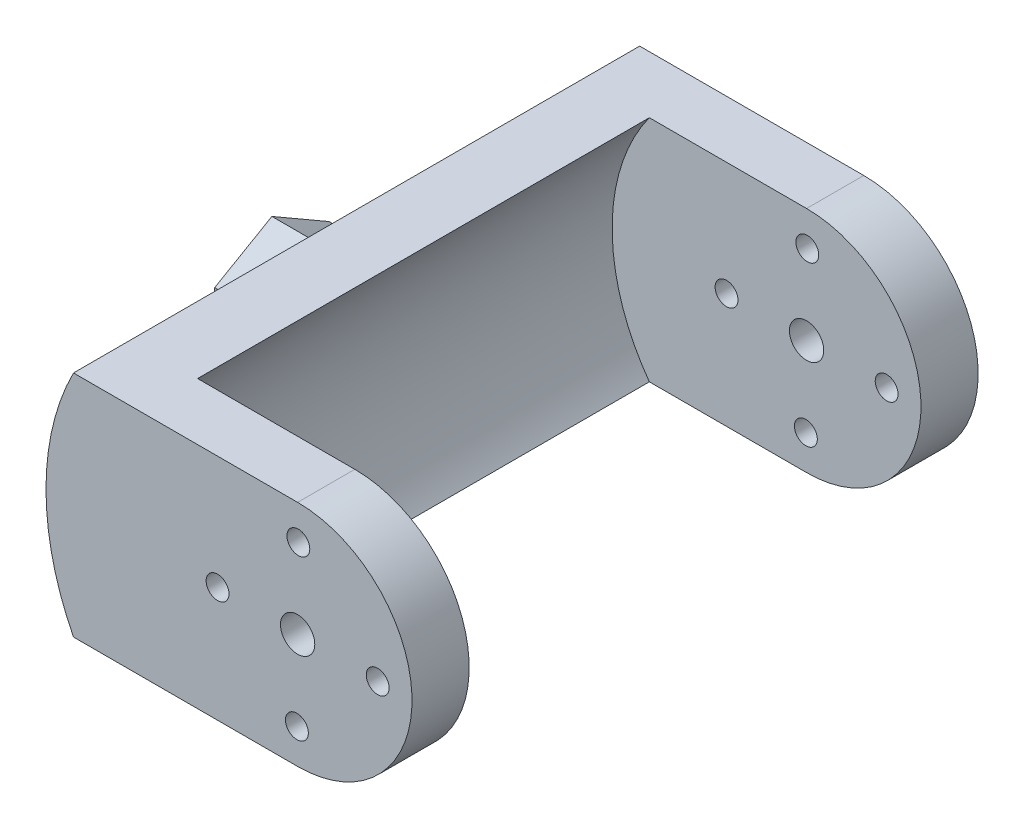
ISO-10303-21;
HEADER;
FILE_DESCRIPTION(('STEP AP214'),'2;1');
FILE_NAME('part.step','',(''),(''),'','','');
FILE_SCHEMA(('AUTOMOTIVE_DESIGN { 1 0 10303 214 1 1 1 1 }'));
ENDSEC;
DATA;
#1=APPLICATION_CONTEXT('core data for automotive mechanical design processes');
#2=APPLICATION_PROTOCOL_DEFINITION('international standard','automotive_design',2000,#1);
#3=PRODUCT_CONTEXT('',#1,'mechanical');
#4=PRODUCT('Part','Part','',(#3));
#5=PRODUCT_RELATED_PRODUCT_CATEGORY('part','',(#4));
#6=PRODUCT_DEFINITION_FORMATION('','',#4);
#7=PRODUCT_DEFINITION_CONTEXT('part definition',#1,'design');
#8=PRODUCT_DEFINITION('design','',#6,#7);
#9=PRODUCT_DEFINITION_SHAPE('','',#8);
#10=(LENGTH_UNIT() NAMED_UNIT(*) SI_UNIT(.MILLI.,.METRE.));
#11=(NAMED_UNIT(*) PLANE_ANGLE_UNIT() SI_UNIT($,.RADIAN.));
#12=(NAMED_UNIT(*) SI_UNIT($,.STERADIAN.) SOLID_ANGLE_UNIT());
#13=UNCERTAINTY_MEASURE_WITH_UNIT(LENGTH_MEASURE(1.E-05),#10,'distance_accuracy_value','');
#14=(GEOMETRIC_REPRESENTATION_CONTEXT(3) GLOBAL_UNCERTAINTY_ASSIGNED_CONTEXT((#13)) GLOBAL_UNIT_ASSIGNED_CONTEXT((#10,
#11,#12)) REPRESENTATION_CONTEXT('',''));
#15=CARTESIAN_POINT('',(0.,0.,0.));
#16=DIRECTION('',(0.,0.,1.));
#17=DIRECTION('',(1.,0.,0.));
#18=AXIS2_PLACEMENT_3D('',#15,#16,#17);
#19=CARTESIAN_POINT('',(18.4154031423768,-9.29712918660288,-44.5));
#20=DIRECTION('',(0.,0.,1.));
#21=DIRECTION('',(1.,0.,0.));
#22=AXIS2_PLACEMENT_3D('',#19,#20,#21);
#23=CYLINDRICAL_SURFACE('',#22,22.);
#24=CARTESIAN_POINT('',(18.4154031423768,-9.29712918660288,5.));
#25=DIRECTION('',(0.,0.,1.));
#26=DIRECTION('',(1.,0.,0.));
#27=AXIS2_PLACEMENT_3D('',#24,#25,#26);
#28=CIRCLE('',#27,22.);
#29=CARTESIAN_POINT('',(-1.1805147998886,0.70287081339713,5.));
#30=VERTEX_POINT('',#29);
#31=CARTESIAN_POINT('',(-1.18051479988861,-19.2971291866029,5.));
#32=VERTEX_POINT('',#31);
#33=EDGE_CURVE('E220',#30,#32,#28,.T.);
#34=ORIENTED_EDGE('',*,*,#33,.F.);
#35=DIRECTION('',(0.,0.,1.));
#36=VECTOR('',#35,1.);
#37=CARTESIAN_POINT('',(-1.1805147998886,0.70287081339713,-44.5));
#38=LINE('',#37,#36);
#39=CARTESIAN_POINT('',(-1.1805147998886,0.70287081339713,-44.5));
#40=VERTEX_POINT('',#39);
#41=EDGE_CURVE('E236',#40,#30,#38,.T.);
#42=ORIENTED_EDGE('',*,*,#41,.F.);
#43=CARTESIAN_POINT('',(18.4154031423768,-9.29712918660288,-44.5));
#44=DIRECTION('',(0.,0.,1.));
#45=DIRECTION('',(1.,0.,0.));
#46=AXIS2_PLACEMENT_3D('',#43,#44,#45);
#47=CIRCLE('',#46,22.);
#48=CARTESIAN_POINT('',(-1.18051479988861,-19.2971291866029,-44.5));
#49=VERTEX_POINT('',#48);
#50=EDGE_CURVE('E223',#40,#49,#47,.T.);
#51=ORIENTED_EDGE('',*,*,#50,.T.);
#52=DIRECTION('',(0.,0.,1.));
#53=VECTOR('',#52,1.);
#54=CARTESIAN_POINT('',(-1.18051479988861,-19.2971291866029,-44.5));
#55=LINE('',#54,#53);
#56=EDGE_CURVE('E233',#49,#32,#55,.T.);
#57=ORIENTED_EDGE('',*,*,#56,.T.);
#58=EDGE_LOOP('',(#34,#42,#51,#57));
#59=FACE_BOUND('',#58,.T.);
#60=CARTESIAN_POINT('',(18.4154031423768,-9.29712918660288,-9.74999999999999));
#61=DIRECTION('',(0.,0.866025403784439,-0.5));
#62=DIRECTION('',(0.,0.5,0.866025403784439));
#63=AXIS2_PLACEMENT_3D('',#60,#61,#62);
#64=ELLIPSE('',#63,44.,22.);
#65=CARTESIAN_POINT('',(-3.39438059489731,-12.183880532551,-14.75));
#66=VERTEX_POINT('',#65);
#67=CARTESIAN_POINT('',(-2.81350796174406,-15.0706318784991,-19.75));
#68=VERTEX_POINT('',#67);
#69=EDGE_CURVE('E294',#66,#68,#64,.F.);
#70=ORIENTED_EDGE('',*,*,#69,.T.);
#71=CARTESIAN_POINT('',(18.4154031423768,-9.29712918660288,-29.75));
#72=DIRECTION('',(0.,0.866025403784439,0.5));
#73=DIRECTION('',(0.,-0.5,0.866025403784439));
#74=AXIS2_PLACEMENT_3D('',#71,#72,#73);
#75=ELLIPSE('',#74,44.,22.);
#76=CARTESIAN_POINT('',(-3.3943805948973,-12.183880532551,-24.75));
#77=VERTEX_POINT('',#76);
#78=EDGE_CURVE('E11',#68,#77,#75,.F.);
#79=ORIENTED_EDGE('',*,*,#78,.T.);
#80=CARTESIAN_POINT('',(18.4154031423768,-9.29712918660288,-24.75));
#81=DIRECTION('',(0.,0.,1.));
#82=DIRECTION('',(1.,0.,0.));
#83=AXIS2_PLACEMENT_3D('',#80,#81,#82);
#84=CIRCLE('',#83,22.);
#85=CARTESIAN_POINT('',(-3.39438059489731,-6.41037784065474,-24.75));
#86=VERTEX_POINT('',#85);
#87=EDGE_CURVE('E40',#77,#86,#84,.F.);
#88=ORIENTED_EDGE('',*,*,#87,.T.);
#89=CARTESIAN_POINT('',(18.4154031423768,-9.29712918660288,-29.75));
#90=DIRECTION('',(0.,-0.866025403784439,0.5));
#91=DIRECTION('',(0.,0.5,0.866025403784439));
#92=AXIS2_PLACEMENT_3D('',#89,#90,#91);
#93=ELLIPSE('',#92,44.,22.);
#94=CARTESIAN_POINT('',(-2.81350796174407,-3.52362649470662,-19.75));
#95=VERTEX_POINT('',#94);
#96=EDGE_CURVE('E303',#86,#95,#93,.F.);
#97=ORIENTED_EDGE('',*,*,#96,.T.);
#98=CARTESIAN_POINT('',(18.4154031423768,-9.29712918660288,-9.74999999999999));
#99=DIRECTION('',(0.,-0.866025403784439,-0.5));
#100=DIRECTION('',(0.,-0.5,0.866025403784439));
#101=AXIS2_PLACEMENT_3D('',#98,#99,#100);
#102=ELLIPSE('',#101,44.,22.);
#103=CARTESIAN_POINT('',(-3.3943805948973,-6.41037784065474,-14.75));
#104=VERTEX_POINT('',#103);
#105=EDGE_CURVE('E300',#95,#104,#102,.F.);
#106=ORIENTED_EDGE('',*,*,#105,.T.);
#107=CARTESIAN_POINT('',(18.4154031423768,-9.29712918660288,-14.75));
#108=DIRECTION('',(0.,0.,-1.));
#109=DIRECTION('',(0.,1.,0.));
#110=AXIS2_PLACEMENT_3D('',#107,#108,#109);
#111=CIRCLE('',#110,22.);
#112=EDGE_CURVE('E297',#104,#66,#111,.F.);
#113=ORIENTED_EDGE('',*,*,#112,.T.);
#114=EDGE_LOOP('',(#70,#79,#88,#97,#106,#113));
#115=FACE_BOUND('',#114,.T.);
#116=ADVANCED_FACE('F32',(#59,#115),#23,.T.);
#117=CARTESIAN_POINT('',(18.4154031423768,-9.29712918660288,-44.5));
#118=DIRECTION('',(0.,0.,1.));
#119=DIRECTION('',(1.,0.,0.));
#120=AXIS2_PLACEMENT_3D('',#117,#118,#119);
#121=CYLINDRICAL_SURFACE('',#120,17.);
#122=CARTESIAN_POINT('',(18.4154031423768,-9.29712918660288,-39.5));
#123=DIRECTION('',(0.,0.,-1.));
#124=DIRECTION('',(-1.,0.,0.));
#125=AXIS2_PLACEMENT_3D('',#122,#123,#124);
#126=CIRCLE('',#125,17.);
#127=CARTESIAN_POINT('',(4.66767605750929,-19.2971291866029,-39.5));
#128=VERTEX_POINT('',#127);
#129=CARTESIAN_POINT('',(4.6676760575093,0.702870813397126,-39.5));
#130=VERTEX_POINT('',#129);
#131=EDGE_CURVE('E292',#128,#130,#126,.T.);
#132=ORIENTED_EDGE('',*,*,#131,.T.);
#133=DIRECTION('',(0.,0.,1.));
#134=VECTOR('',#133,1.);
#135=CARTESIAN_POINT('',(4.6676760575093,0.702870813397128,-44.5));
#136=LINE('',#135,#134);
#137=CARTESIAN_POINT('',(4.6676760575093,0.702870813397121,0.));
#138=VERTEX_POINT('',#137);
#139=EDGE_CURVE('E228',#130,#138,#136,.T.);
#140=ORIENTED_EDGE('',*,*,#139,.T.);
#141=CARTESIAN_POINT('',(18.4154031423768,-9.29712918660288,0.));
#142=DIRECTION('',(0.,0.,1.));
#143=DIRECTION('',(1.,0.,0.));
#144=AXIS2_PLACEMENT_3D('',#141,#142,#143);
#145=CIRCLE('',#144,17.);
#146=CARTESIAN_POINT('',(4.6676760575093,-19.2971291866029,0.));
#147=VERTEX_POINT('',#146);
#148=EDGE_CURVE('E232',#147,#138,#145,.F.);
#149=ORIENTED_EDGE('',*,*,#148,.F.);
#150=DIRECTION('',(0.,0.,1.));
#151=VECTOR('',#150,1.);
#152=CARTESIAN_POINT('',(4.66767605750929,-19.2971291866029,-44.5));
#153=LINE('',#152,#151);
#154=EDGE_CURVE('E55',#128,#147,#153,.T.);
#155=ORIENTED_EDGE('',*,*,#154,.F.);
#156=EDGE_LOOP('',(#132,#140,#149,#155));
#157=FACE_BOUND('',#156,.T.);
#158=ADVANCED_FACE('F326',(#157),#121,.F.);
#159=CARTESIAN_POINT('',(-4.03454117826684,-8.29712918660287,5.));
#160=DIRECTION('',(0.,0.,1.));
#161=DIRECTION('',(1.,0.,0.));
#162=AXIS2_PLACEMENT_3D('',#159,#160,#161);
#163=PLANE('',#162);
#164=DIRECTION('',(1.,0.,0.));
#165=VECTOR('',#164,1.);
#166=CARTESIAN_POINT('',(26.1986671424018,-19.2971291866029,5.));
#167=LINE('',#166,#165);
#168=CARTESIAN_POINT('',(18.4154031423768,-19.2971291866029,5.));
#169=VERTEX_POINT('',#168);
#170=EDGE_CURVE('E243',#32,#169,#167,.T.);
#171=ORIENTED_EDGE('',*,*,#170,.T.);
#172=CARTESIAN_POINT('',(18.4154031423768,-9.29712918660288,5.));
#173=DIRECTION('',(0.,0.,1.));
#174=DIRECTION('',(1.,0.,0.));
#175=AXIS2_PLACEMENT_3D('',#172,#173,#174);
#176=CIRCLE('',#175,10.);
#177=CARTESIAN_POINT('',(18.4154031423768,0.702870813397129,5.));
#178=VERTEX_POINT('',#177);
#179=EDGE_CURVE('E282',#169,#178,#176,.T.);
#180=ORIENTED_EDGE('',*,*,#179,.T.);
#181=DIRECTION('',(-1.,0.,0.));
#182=VECTOR('',#181,1.);
#183=CARTESIAN_POINT('',(26.1986671424018,0.702870813397122,5.));
#184=LINE('',#183,#182);
#185=EDGE_CURVE('E248',#178,#30,#184,.T.);
#186=ORIENTED_EDGE('',*,*,#185,.T.);
#187=ORIENTED_EDGE('',*,*,#33,.T.);
#188=EDGE_LOOP('',(#171,#180,#186,#187));
#189=FACE_BOUND('',#188,.T.);
#190=CARTESIAN_POINT('',(11.4154031423768,-9.2346746111763,5.));
#191=DIRECTION('',(0.,0.,1.));
#192=DIRECTION('',(1.,0.,0.));
#193=AXIS2_PLACEMENT_3D('',#190,#191,#192);
#194=CIRCLE('',#193,1.);
#195=CARTESIAN_POINT('',(12.4154031423768,-9.2346746111763,5.));
#196=VERTEX_POINT('',#195);
#197=EDGE_CURVE('E258',#196,#196,#194,.T.);
#198=ORIENTED_EDGE('',*,*,#197,.F.);
#199=EDGE_LOOP('',(#198));
#200=FACE_BOUND('',#199,.T.);
#201=CARTESIAN_POINT('',(25.4154031423768,-9.35958376202946,5.));
#202=DIRECTION('',(0.,0.,1.));
#203=DIRECTION('',(1.,0.,0.));
#204=AXIS2_PLACEMENT_3D('',#201,#202,#203);
#205=CIRCLE('',#204,0.999999999999998);
#206=CARTESIAN_POINT('',(26.4154031423768,-9.35958376202946,5.));
#207=VERTEX_POINT('',#206);
#208=EDGE_CURVE('E270',#207,#207,#205,.T.);
#209=ORIENTED_EDGE('',*,*,#208,.F.);
#210=EDGE_LOOP('',(#209));
#211=FACE_BOUND('',#210,.T.);
#212=CARTESIAN_POINT('',(18.4778577178034,-2.29712918660288,5.));
#213=DIRECTION('',(0.,0.,1.));
#214=DIRECTION('',(1.,0.,0.));
#215=AXIS2_PLACEMENT_3D('',#212,#213,#214);
#216=CIRCLE('',#215,1.);
#217=CARTESIAN_POINT('',(19.4778577178034,-2.29712918660288,5.));
#218=VERTEX_POINT('',#217);
#219=EDGE_CURVE('E276',#218,#218,#216,.T.);
#220=ORIENTED_EDGE('',*,*,#219,.F.);
#221=EDGE_LOOP('',(#220));
#222=FACE_BOUND('',#221,.T.);
#223=CARTESIAN_POINT('',(18.4154031423768,-9.29712918660288,5.));
#224=DIRECTION('',(0.,0.,1.));
#225=DIRECTION('',(1.,0.,0.));
#226=AXIS2_PLACEMENT_3D('',#223,#224,#225);
#227=CIRCLE('',#226,1.5);
#228=CARTESIAN_POINT('',(19.9154031423768,-9.29712918660288,5.));
#229=VERTEX_POINT('',#228);
#230=EDGE_CURVE('E264',#229,#229,#227,.T.);
#231=ORIENTED_EDGE('',*,*,#230,.F.);
#232=EDGE_LOOP('',(#231));
#233=FACE_BOUND('',#232,.T.);
#234=CARTESIAN_POINT('',(18.3529485669502,-16.2971291866029,5.));
#235=DIRECTION('',(0.,0.,1.));
#236=DIRECTION('',(1.,0.,0.));
#237=AXIS2_PLACEMENT_3D('',#234,#235,#236);
#238=CIRCLE('',#237,0.999999999999998);
#239=CARTESIAN_POINT('',(19.3529485669502,-16.2971291866029,5.));
#240=VERTEX_POINT('',#239);
#241=EDGE_CURVE('E252',#240,#240,#238,.T.);
#242=ORIENTED_EDGE('',*,*,#241,.F.);
#243=EDGE_LOOP('',(#242));
#244=FACE_BOUND('',#243,.T.);
#245=ADVANCED_FACE('F332',(#189,#200,#211,#222,#233,#244),#163,.T.);
#246=CARTESIAN_POINT('',(-4.03454117826684,-8.29712918660287,0.));
#247=DIRECTION('',(0.,0.,1.));
#248=DIRECTION('',(1.,0.,0.));
#249=AXIS2_PLACEMENT_3D('',#246,#247,#248);
#250=PLANE('',#249);
#251=DIRECTION('',(1.,0.,0.));
#252=VECTOR('',#251,1.);
#253=CARTESIAN_POINT('',(26.1986671424018,-19.2971291866029,0.));
#254=LINE('',#253,#252);
#255=CARTESIAN_POINT('',(18.4154031423768,-19.2971291866029,0.));
#256=VERTEX_POINT('',#255);
#257=EDGE_CURVE('E246',#147,#256,#254,.T.);
#258=ORIENTED_EDGE('',*,*,#257,.F.);
#259=ORIENTED_EDGE('',*,*,#148,.T.);
#260=DIRECTION('',(-1.,0.,0.));
#261=VECTOR('',#260,1.);
#262=CARTESIAN_POINT('',(26.1986671424018,0.702870813397122,0.));
#263=LINE('',#262,#261);
#264=CARTESIAN_POINT('',(18.4154031423768,0.702870813397129,0.));
#265=VERTEX_POINT('',#264);
#266=EDGE_CURVE('E242',#265,#138,#263,.T.);
#267=ORIENTED_EDGE('',*,*,#266,.F.);
#268=CARTESIAN_POINT('',(18.4154031423768,-9.29712918660288,0.));
#269=DIRECTION('',(0.,0.,1.));
#270=DIRECTION('',(1.,0.,0.));
#271=AXIS2_PLACEMENT_3D('',#268,#269,#270);
#272=CIRCLE('',#271,10.);
#273=EDGE_CURVE('E279',#256,#265,#272,.T.);
#274=ORIENTED_EDGE('',*,*,#273,.F.);
#275=EDGE_LOOP('',(#258,#259,#267,#274));
#276=FACE_BOUND('',#275,.T.);
#277=CARTESIAN_POINT('',(18.4778577178034,-2.29712918660288,0.));
#278=DIRECTION('',(0.,0.,1.));
#279=DIRECTION('',(1.,0.,0.));
#280=AXIS2_PLACEMENT_3D('',#277,#278,#279);
#281=CIRCLE('',#280,1.);
#282=CARTESIAN_POINT('',(19.4778577178034,-2.29712918660288,0.));
#283=VERTEX_POINT('',#282);
#284=EDGE_CURVE('E273',#283,#283,#281,.T.);
#285=ORIENTED_EDGE('',*,*,#284,.T.);
#286=EDGE_LOOP('',(#285));
#287=FACE_BOUND('',#286,.T.);
#288=CARTESIAN_POINT('',(25.4154031423768,-9.35958376202946,0.));
#289=DIRECTION('',(0.,0.,1.));
#290=DIRECTION('',(1.,0.,0.));
#291=AXIS2_PLACEMENT_3D('',#288,#289,#290);
#292=CIRCLE('',#291,0.999999999999998);
#293=CARTESIAN_POINT('',(26.4154031423768,-9.35958376202946,0.));
#294=VERTEX_POINT('',#293);
#295=EDGE_CURVE('E267',#294,#294,#292,.T.);
#296=ORIENTED_EDGE('',*,*,#295,.T.);
#297=EDGE_LOOP('',(#296));
#298=FACE_BOUND('',#297,.T.);
#299=CARTESIAN_POINT('',(18.4154031423768,-9.29712918660288,0.));
#300=DIRECTION('',(0.,0.,1.));
#301=DIRECTION('',(1.,0.,0.));
#302=AXIS2_PLACEMENT_3D('',#299,#300,#301);
#303=CIRCLE('',#302,1.5);
#304=CARTESIAN_POINT('',(19.9154031423768,-9.29712918660288,0.));
#305=VERTEX_POINT('',#304);
#306=EDGE_CURVE('E261',#305,#305,#303,.T.);
#307=ORIENTED_EDGE('',*,*,#306,.T.);
#308=EDGE_LOOP('',(#307));
#309=FACE_BOUND('',#308,.T.);
#310=CARTESIAN_POINT('',(11.4154031423768,-9.2346746111763,0.));
#311=DIRECTION('',(0.,0.,1.));
#312=DIRECTION('',(1.,0.,0.));
#313=AXIS2_PLACEMENT_3D('',#310,#311,#312);
#314=CIRCLE('',#313,1.);
#315=CARTESIAN_POINT('',(12.4154031423768,-9.2346746111763,0.));
#316=VERTEX_POINT('',#315);
#317=EDGE_CURVE('E255',#316,#316,#314,.T.);
#318=ORIENTED_EDGE('',*,*,#317,.T.);
#319=EDGE_LOOP('',(#318));
#320=FACE_BOUND('',#319,.T.);
#321=CARTESIAN_POINT('',(18.3529485669502,-16.2971291866029,0.));
#322=DIRECTION('',(0.,0.,1.));
#323=DIRECTION('',(1.,0.,0.));
#324=AXIS2_PLACEMENT_3D('',#321,#322,#323);
#325=CIRCLE('',#324,0.999999999999998);
#326=CARTESIAN_POINT('',(19.3529485669502,-16.2971291866029,0.));
#327=VERTEX_POINT('',#326);
#328=EDGE_CURVE('E245',#327,#327,#325,.T.);
#329=ORIENTED_EDGE('',*,*,#328,.T.);
#330=EDGE_LOOP('',(#329));
#331=FACE_BOUND('',#330,.T.);
#332=ADVANCED_FACE('F368',(#276,#287,#298,#309,#320,#331),#250,.F.);
#333=CARTESIAN_POINT('',(18.4154031423768,-9.29712918660288,5.));
#334=DIRECTION('',(0.,0.,-1.));
#335=DIRECTION('',(-1.,0.,0.));
#336=AXIS2_PLACEMENT_3D('',#333,#334,#335);
#337=CYLINDRICAL_SURFACE('',#336,10.);
#338=ORIENTED_EDGE('',*,*,#273,.T.);
#339=DIRECTION('',(0.,0.,-1.));
#340=VECTOR('',#339,1.);
#341=CARTESIAN_POINT('',(18.4154031423768,0.702870813397122,5.));
#342=LINE('',#341,#340);
#343=EDGE_CURVE('E285',#178,#265,#342,.T.);
#344=ORIENTED_EDGE('',*,*,#343,.F.);
#345=ORIENTED_EDGE('',*,*,#179,.F.);
#346=DIRECTION('',(0.,0.,-1.));
#347=VECTOR('',#346,1.);
#348=CARTESIAN_POINT('',(18.4154031423768,-19.2971291866029,5.));
#349=LINE('',#348,#347);
#350=EDGE_CURVE('E289',#169,#256,#349,.T.);
#351=ORIENTED_EDGE('',*,*,#350,.T.);
#352=EDGE_LOOP('',(#338,#344,#345,#351));
#353=FACE_BOUND('',#352,.T.);
#354=ADVANCED_FACE('F34',(#353),#337,.T.);
#355=CARTESIAN_POINT('',(18.4778577178034,-2.29712918660288,5.));
#356=DIRECTION('',(0.,0.,-1.));
#357=DIRECTION('',(-1.,0.,0.));
#358=AXIS2_PLACEMENT_3D('',#355,#356,#357);
#359=CYLINDRICAL_SURFACE('',#358,1.);
#360=ORIENTED_EDGE('',*,*,#219,.T.);
#361=EDGE_LOOP('',(#360));
#362=FACE_BOUND('',#361,.T.);
#363=ORIENTED_EDGE('',*,*,#284,.F.);
#364=EDGE_LOOP('',(#363));
#365=FACE_BOUND('',#364,.T.);
#366=ADVANCED_FACE('F362',(#362,#365),#359,.F.);
#367=CARTESIAN_POINT('',(25.4154031423768,-9.35958376202946,5.));
#368=DIRECTION('',(0.,0.,-1.));
#369=DIRECTION('',(-1.,0.,0.));
#370=AXIS2_PLACEMENT_3D('',#367,#368,#369);
#371=CYLINDRICAL_SURFACE('',#370,0.999999999999998);
#372=ORIENTED_EDGE('',*,*,#208,.T.);
#373=EDGE_LOOP('',(#372));
#374=FACE_BOUND('',#373,.T.);
#375=ORIENTED_EDGE('',*,*,#295,.F.);
#376=EDGE_LOOP('',(#375));
#377=FACE_BOUND('',#376,.T.);
#378=ADVANCED_FACE('F358',(#374,#377),#371,.F.);
#379=CARTESIAN_POINT('',(18.4154031423768,-9.29712918660288,5.));
#380=DIRECTION('',(0.,0.,-1.));
#381=DIRECTION('',(-1.,0.,0.));
#382=AXIS2_PLACEMENT_3D('',#379,#380,#381);
#383=CYLINDRICAL_SURFACE('',#382,1.5);
#384=ORIENTED_EDGE('',*,*,#230,.T.);
#385=EDGE_LOOP('',(#384));
#386=FACE_BOUND('',#385,.T.);
#387=ORIENTED_EDGE('',*,*,#306,.F.);
#388=EDGE_LOOP('',(#387));
#389=FACE_BOUND('',#388,.T.);
#390=ADVANCED_FACE('F354',(#386,#389),#383,.F.);
#391=CARTESIAN_POINT('',(11.4154031423768,-9.2346746111763,5.));
#392=DIRECTION('',(0.,0.,-1.));
#393=DIRECTION('',(-1.,0.,0.));
#394=AXIS2_PLACEMENT_3D('',#391,#392,#393);
#395=CYLINDRICAL_SURFACE('',#394,1.);
#396=ORIENTED_EDGE('',*,*,#197,.T.);
#397=EDGE_LOOP('',(#396));
#398=FACE_BOUND('',#397,.T.);
#399=ORIENTED_EDGE('',*,*,#317,.F.);
#400=EDGE_LOOP('',(#399));
#401=FACE_BOUND('',#400,.T.);
#402=ADVANCED_FACE('F350',(#398,#401),#395,.F.);
#403=CARTESIAN_POINT('',(18.3529485669502,-16.2971291866029,5.));
#404=DIRECTION('',(0.,0.,-1.));
#405=DIRECTION('',(-1.,0.,0.));
#406=AXIS2_PLACEMENT_3D('',#403,#404,#405);
#407=CYLINDRICAL_SURFACE('',#406,0.999999999999998);
#408=ORIENTED_EDGE('',*,*,#241,.T.);
#409=EDGE_LOOP('',(#408));
#410=FACE_BOUND('',#409,.T.);
#411=ORIENTED_EDGE('',*,*,#328,.F.);
#412=EDGE_LOOP('',(#411));
#413=FACE_BOUND('',#412,.T.);
#414=ADVANCED_FACE('F346',(#410,#413),#407,.F.);
#415=CARTESIAN_POINT('',(26.1986671424018,0.702870813397122,5.));
#416=DIRECTION('',(0.,-1.,0.));
#417=DIRECTION('',(1.,0.,0.));
#418=AXIS2_PLACEMENT_3D('',#415,#416,#417);
#419=PLANE('',#418);
#420=ORIENTED_EDGE('',*,*,#139,.F.);
#421=DIRECTION('',(1.,0.,0.));
#422=VECTOR('',#421,1.);
#423=CARTESIAN_POINT('',(1.41540314237681,0.702870813397125,-39.5));
#424=LINE('',#423,#422);
#425=CARTESIAN_POINT('',(18.4154031423768,0.702870813397129,-39.5));
#426=VERTEX_POINT('',#425);
#427=EDGE_CURVE('E208',#130,#426,#424,.T.);
#428=ORIENTED_EDGE('',*,*,#427,.T.);
#429=DIRECTION('',(0.,0.,1.));
#430=VECTOR('',#429,1.);
#431=CARTESIAN_POINT('',(18.4154031423768,0.702870813397129,-44.5));
#432=LINE('',#431,#430);
#433=CARTESIAN_POINT('',(18.4154031423768,0.702870813397129,-44.5));
#434=VERTEX_POINT('',#433);
#435=EDGE_CURVE('E207',#434,#426,#432,.T.);
#436=ORIENTED_EDGE('',*,*,#435,.F.);
#437=DIRECTION('',(-1.,0.,0.));
#438=VECTOR('',#437,1.);
#439=CARTESIAN_POINT('',(4.6676760575093,0.702870813397128,-44.5));
#440=LINE('',#439,#438);
#441=EDGE_CURVE('E221',#434,#40,#440,.T.);
#442=ORIENTED_EDGE('',*,*,#441,.T.);
#443=ORIENTED_EDGE('',*,*,#41,.T.);
#444=ORIENTED_EDGE('',*,*,#185,.F.);
#445=ORIENTED_EDGE('',*,*,#343,.T.);
#446=ORIENTED_EDGE('',*,*,#266,.T.);
#447=EDGE_LOOP('',(#420,#428,#436,#442,#443,#444,#445,#446));
#448=FACE_BOUND('',#447,.T.);
#449=ADVANCED_FACE('F342',(#448),#419,.F.);
#450=CARTESIAN_POINT('',(26.1986671424018,-19.2971291866029,5.));
#451=DIRECTION('',(0.,1.,0.));
#452=DIRECTION('',(0.,0.,1.));
#453=AXIS2_PLACEMENT_3D('',#450,#451,#452);
#454=PLANE('',#453);
#455=DIRECTION('',(1.,0.,0.));
#456=VECTOR('',#455,1.);
#457=CARTESIAN_POINT('',(4.66767605750929,-19.2971291866029,-44.5));
#458=LINE('',#457,#456);
#459=CARTESIAN_POINT('',(18.4154031423768,-19.2971291866029,-44.5));
#460=VERTEX_POINT('',#459);
#461=EDGE_CURVE('E226',#49,#460,#458,.T.);
#462=ORIENTED_EDGE('',*,*,#461,.T.);
#463=DIRECTION('',(0.,0.,1.));
#464=VECTOR('',#463,1.);
#465=CARTESIAN_POINT('',(18.4154031423768,-19.2971291866029,-44.5));
#466=LINE('',#465,#464);
#467=CARTESIAN_POINT('',(18.4154031423768,-19.2971291866029,-39.5));
#468=VERTEX_POINT('',#467);
#469=EDGE_CURVE('E217',#460,#468,#466,.T.);
#470=ORIENTED_EDGE('',*,*,#469,.T.);
#471=DIRECTION('',(-1.,0.,0.));
#472=VECTOR('',#471,1.);
#473=CARTESIAN_POINT('',(18.4154031423768,-19.2971291866029,-39.5));
#474=LINE('',#473,#472);
#475=EDGE_CURVE('E211',#468,#128,#474,.T.);
#476=ORIENTED_EDGE('',*,*,#475,.T.);
#477=ORIENTED_EDGE('',*,*,#154,.T.);
#478=ORIENTED_EDGE('',*,*,#257,.T.);
#479=ORIENTED_EDGE('',*,*,#350,.F.);
#480=ORIENTED_EDGE('',*,*,#170,.F.);
#481=ORIENTED_EDGE('',*,*,#56,.F.);
#482=EDGE_LOOP('',(#462,#470,#476,#477,#478,#479,#480,#481));
#483=FACE_BOUND('',#482,.T.);
#484=ADVANCED_FACE('F339',(#483),#454,.F.);
#485=CARTESIAN_POINT('',(18.4154031423768,-9.29712918660288,-44.5));
#486=DIRECTION('',(0.,0.,1.));
#487=DIRECTION('',(1.,0.,0.));
#488=AXIS2_PLACEMENT_3D('',#485,#486,#487);
#489=PLANE('',#488);
#490=ORIENTED_EDGE('',*,*,#441,.F.);
#491=CARTESIAN_POINT('',(18.4154031423768,-9.29712918660288,-44.5));
#492=DIRECTION('',(0.,0.,-1.));
#493=DIRECTION('',(-1.,0.,0.));
#494=AXIS2_PLACEMENT_3D('',#491,#492,#493);
#495=CIRCLE('',#494,10.);
#496=EDGE_CURVE('E204',#434,#460,#495,.T.);
#497=ORIENTED_EDGE('',*,*,#496,.T.);
#498=ORIENTED_EDGE('',*,*,#461,.F.);
#499=ORIENTED_EDGE('',*,*,#50,.F.);
#500=EDGE_LOOP('',(#490,#497,#498,#499));
#501=FACE_BOUND('',#500,.T.);
#502=CARTESIAN_POINT('',(18.4778577178034,-2.29712918660288,-44.5));
#503=DIRECTION('',(0.,0.,-1.));
#504=DIRECTION('',(-1.,0.,0.));
#505=AXIS2_PLACEMENT_3D('',#502,#503,#504);
#506=CIRCLE('',#505,1.);
#507=CARTESIAN_POINT('',(17.4778577178034,-2.29712918660288,-44.5));
#508=VERTEX_POINT('',#507);
#509=EDGE_CURVE('E180',#508,#508,#506,.T.);
#510=ORIENTED_EDGE('',*,*,#509,.F.);
#511=EDGE_LOOP('',(#510));
#512=FACE_BOUND('',#511,.T.);
#513=CARTESIAN_POINT('',(18.3529485669502,-16.2971291866029,-44.5));
#514=DIRECTION('',(0.,0.,-1.));
#515=DIRECTION('',(-1.,0.,0.));
#516=AXIS2_PLACEMENT_3D('',#513,#514,#515);
#517=CIRCLE('',#516,0.999999999999998);
#518=CARTESIAN_POINT('',(17.3529485669502,-16.2971291866029,-44.5));
#519=VERTEX_POINT('',#518);
#520=EDGE_CURVE('E192',#519,#519,#517,.T.);
#521=ORIENTED_EDGE('',*,*,#520,.F.);
#522=EDGE_LOOP('',(#521));
#523=FACE_BOUND('',#522,.T.);
#524=CARTESIAN_POINT('',(11.4154031423768,-9.2346746111763,-44.5));
#525=DIRECTION('',(0.,0.,-1.));
#526=DIRECTION('',(-1.,0.,0.));
#527=AXIS2_PLACEMENT_3D('',#524,#525,#526);
#528=CIRCLE('',#527,1.);
#529=CARTESIAN_POINT('',(10.4154031423768,-9.2346746111763,-44.5));
#530=VERTEX_POINT('',#529);
#531=EDGE_CURVE('E198',#530,#530,#528,.T.);
#532=ORIENTED_EDGE('',*,*,#531,.F.);
#533=EDGE_LOOP('',(#532));
#534=FACE_BOUND('',#533,.T.);
#535=CARTESIAN_POINT('',(18.4154031423768,-9.29712918660288,-44.5));
#536=DIRECTION('',(0.,0.,-1.));
#537=DIRECTION('',(-1.,0.,0.));
#538=AXIS2_PLACEMENT_3D('',#535,#536,#537);
#539=CIRCLE('',#538,1.5);
#540=CARTESIAN_POINT('',(16.9154031423768,-9.29712918660288,-44.5));
#541=VERTEX_POINT('',#540);
#542=EDGE_CURVE('E186',#541,#541,#539,.T.);
#543=ORIENTED_EDGE('',*,*,#542,.F.);
#544=EDGE_LOOP('',(#543));
#545=FACE_BOUND('',#544,.T.);
#546=CARTESIAN_POINT('',(25.4154031423768,-9.35958376202946,-44.5));
#547=DIRECTION('',(0.,0.,-1.));
#548=DIRECTION('',(-1.,0.,0.));
#549=AXIS2_PLACEMENT_3D('',#546,#547,#548);
#550=CIRCLE('',#549,0.999999999999998);
#551=CARTESIAN_POINT('',(24.4154031423768,-9.35958376202946,-44.5));
#552=VERTEX_POINT('',#551);
#553=EDGE_CURVE('E174',#552,#552,#550,.T.);
#554=ORIENTED_EDGE('',*,*,#553,.F.);
#555=EDGE_LOOP('',(#554));
#556=FACE_BOUND('',#555,.T.);
#557=ADVANCED_FACE('F336',(#501,#512,#523,#534,#545,#556),#489,.F.);
#558=CARTESIAN_POINT('',(18.4154031423768,-9.29712918660288,-39.5));
#559=DIRECTION('',(0.,0.,-1.));
#560=DIRECTION('',(-1.,0.,0.));
#561=AXIS2_PLACEMENT_3D('',#558,#559,#560);
#562=PLANE('',#561);
#563=CARTESIAN_POINT('',(11.4154031423768,-9.2346746111763,-39.5));
#564=DIRECTION('',(0.,0.,-1.));
#565=DIRECTION('',(-1.,0.,0.));
#566=AXIS2_PLACEMENT_3D('',#563,#564,#565);
#567=CIRCLE('',#566,1.);
#568=CARTESIAN_POINT('',(10.4154031423768,-9.2346746111763,-39.5));
#569=VERTEX_POINT('',#568);
#570=EDGE_CURVE('E195',#569,#569,#567,.T.);
#571=ORIENTED_EDGE('',*,*,#570,.T.);
#572=EDGE_LOOP('',(#571));
#573=FACE_BOUND('',#572,.T.);
#574=CARTESIAN_POINT('',(18.3529485669502,-16.2971291866029,-39.5));
#575=DIRECTION('',(0.,0.,-1.));
#576=DIRECTION('',(-1.,0.,0.));
#577=AXIS2_PLACEMENT_3D('',#574,#575,#576);
#578=CIRCLE('',#577,0.999999999999998);
#579=CARTESIAN_POINT('',(17.3529485669502,-16.2971291866029,-39.5));
#580=VERTEX_POINT('',#579);
#581=EDGE_CURVE('E189',#580,#580,#578,.T.);
#582=ORIENTED_EDGE('',*,*,#581,.T.);
#583=EDGE_LOOP('',(#582));
#584=FACE_BOUND('',#583,.T.);
#585=CARTESIAN_POINT('',(18.4154031423768,-9.29712918660288,-39.5));
#586=DIRECTION('',(0.,0.,-1.));
#587=DIRECTION('',(-1.,0.,0.));
#588=AXIS2_PLACEMENT_3D('',#585,#586,#587);
#589=CIRCLE('',#588,1.5);
#590=CARTESIAN_POINT('',(16.9154031423768,-9.29712918660288,-39.5));
#591=VERTEX_POINT('',#590);
#592=EDGE_CURVE('E183',#591,#591,#589,.T.);
#593=ORIENTED_EDGE('',*,*,#592,.T.);
#594=EDGE_LOOP('',(#593));
#595=FACE_BOUND('',#594,.T.);
#596=CARTESIAN_POINT('',(18.4778577178034,-2.29712918660288,-39.5));
#597=DIRECTION('',(0.,0.,-1.));
#598=DIRECTION('',(-1.,0.,0.));
#599=AXIS2_PLACEMENT_3D('',#596,#597,#598);
#600=CIRCLE('',#599,1.);
#601=CARTESIAN_POINT('',(17.4778577178034,-2.29712918660288,-39.5));
#602=VERTEX_POINT('',#601);
#603=EDGE_CURVE('E177',#602,#602,#600,.T.);
#604=ORIENTED_EDGE('',*,*,#603,.T.);
#605=EDGE_LOOP('',(#604));
#606=FACE_BOUND('',#605,.T.);
#607=CARTESIAN_POINT('',(25.4154031423768,-9.35958376202946,-39.5));
#608=DIRECTION('',(0.,0.,-1.));
#609=DIRECTION('',(-1.,0.,0.));
#610=AXIS2_PLACEMENT_3D('',#607,#608,#609);
#611=CIRCLE('',#610,0.999999999999998);
#612=CARTESIAN_POINT('',(24.4154031423768,-9.35958376202946,-39.5));
#613=VERTEX_POINT('',#612);
#614=EDGE_CURVE('E141',#613,#613,#611,.T.);
#615=ORIENTED_EDGE('',*,*,#614,.T.);
#616=EDGE_LOOP('',(#615));
#617=FACE_BOUND('',#616,.T.);
#618=ORIENTED_EDGE('',*,*,#427,.F.);
#619=ORIENTED_EDGE('',*,*,#131,.F.);
#620=ORIENTED_EDGE('',*,*,#475,.F.);
#621=CARTESIAN_POINT('',(18.4154031423768,-9.29712918660288,-39.5));
#622=DIRECTION('',(0.,0.,-1.));
#623=DIRECTION('',(-1.,0.,0.));
#624=AXIS2_PLACEMENT_3D('',#621,#622,#623);
#625=CIRCLE('',#624,10.);
#626=EDGE_CURVE('E201',#426,#468,#625,.T.);
#627=ORIENTED_EDGE('',*,*,#626,.F.);
#628=EDGE_LOOP('',(#618,#619,#620,#627));
#629=FACE_BOUND('',#628,.T.);
#630=ADVANCED_FACE('F400',(#573,#584,#595,#606,#617,#629),#562,.F.);
#631=CARTESIAN_POINT('',(18.4154031423768,-9.29712918660288,-44.5));
#632=DIRECTION('',(0.,0.,1.));
#633=DIRECTION('',(1.,0.,0.));
#634=AXIS2_PLACEMENT_3D('',#631,#632,#633);
#635=CYLINDRICAL_SURFACE('',#634,10.);
#636=ORIENTED_EDGE('',*,*,#626,.T.);
#637=ORIENTED_EDGE('',*,*,#469,.F.);
#638=ORIENTED_EDGE('',*,*,#496,.F.);
#639=ORIENTED_EDGE('',*,*,#435,.T.);
#640=EDGE_LOOP('',(#636,#637,#638,#639));
#641=FACE_BOUND('',#640,.T.);
#642=ADVANCED_FACE('F403',(#641),#635,.T.);
#643=CARTESIAN_POINT('',(11.4154031423768,-9.2346746111763,-44.5));
#644=DIRECTION('',(0.,0.,1.));
#645=DIRECTION('',(1.,0.,0.));
#646=AXIS2_PLACEMENT_3D('',#643,#644,#645);
#647=CYLINDRICAL_SURFACE('',#646,1.);
#648=ORIENTED_EDGE('',*,*,#531,.T.);
#649=EDGE_LOOP('',(#648));
#650=FACE_BOUND('',#649,.T.);
#651=ORIENTED_EDGE('',*,*,#570,.F.);
#652=EDGE_LOOP('',(#651));
#653=FACE_BOUND('',#652,.T.);
#654=ADVANCED_FACE('F446',(#650,#653),#647,.F.);
#655=CARTESIAN_POINT('',(18.3529485669502,-16.2971291866029,-44.5));
#656=DIRECTION('',(0.,0.,1.));
#657=DIRECTION('',(1.,0.,0.));
#658=AXIS2_PLACEMENT_3D('',#655,#656,#657);
#659=CYLINDRICAL_SURFACE('',#658,0.999999999999998);
#660=ORIENTED_EDGE('',*,*,#520,.T.);
#661=EDGE_LOOP('',(#660));
#662=FACE_BOUND('',#661,.T.);
#663=ORIENTED_EDGE('',*,*,#581,.F.);
#664=EDGE_LOOP('',(#663));
#665=FACE_BOUND('',#664,.T.);
#666=ADVANCED_FACE('F451',(#662,#665),#659,.F.);
#667=CARTESIAN_POINT('',(18.4154031423768,-9.29712918660288,-44.5));
#668=DIRECTION('',(0.,0.,1.));
#669=DIRECTION('',(1.,0.,0.));
#670=AXIS2_PLACEMENT_3D('',#667,#668,#669);
#671=CYLINDRICAL_SURFACE('',#670,1.5);
#672=ORIENTED_EDGE('',*,*,#542,.T.);
#673=EDGE_LOOP('',(#672));
#674=FACE_BOUND('',#673,.T.);
#675=ORIENTED_EDGE('',*,*,#592,.F.);
#676=EDGE_LOOP('',(#675));
#677=FACE_BOUND('',#676,.T.);
#678=ADVANCED_FACE('F455',(#674,#677),#671,.F.);
#679=CARTESIAN_POINT('',(18.4778577178034,-2.29712918660288,-44.5));
#680=DIRECTION('',(0.,0.,1.));
#681=DIRECTION('',(1.,0.,0.));
#682=AXIS2_PLACEMENT_3D('',#679,#680,#681);
#683=CYLINDRICAL_SURFACE('',#682,1.);
#684=ORIENTED_EDGE('',*,*,#509,.T.);
#685=EDGE_LOOP('',(#684));
#686=FACE_BOUND('',#685,.T.);
#687=ORIENTED_EDGE('',*,*,#603,.F.);
#688=EDGE_LOOP('',(#687));
#689=FACE_BOUND('',#688,.T.);
#690=ADVANCED_FACE('F436',(#686,#689),#683,.F.);
#691=CARTESIAN_POINT('',(25.4154031423768,-9.35958376202946,-44.5));
#692=DIRECTION('',(0.,0.,1.));
#693=DIRECTION('',(1.,0.,0.));
#694=AXIS2_PLACEMENT_3D('',#691,#692,#693);
#695=CYLINDRICAL_SURFACE('',#694,0.999999999999998);
#696=ORIENTED_EDGE('',*,*,#553,.T.);
#697=EDGE_LOOP('',(#696));
#698=FACE_BOUND('',#697,.T.);
#699=ORIENTED_EDGE('',*,*,#614,.F.);
#700=EDGE_LOOP('',(#699));
#701=FACE_BOUND('',#700,.T.);
#702=ADVANCED_FACE('F433',(#698,#701),#695,.F.);
#703=CARTESIAN_POINT('',(-2.58459685762319,-15.0706318784991,-19.75));
#704=DIRECTION('',(0.,0.866025403784439,0.5));
#705=DIRECTION('',(0.,-0.5,0.866025403784439));
#706=AXIS2_PLACEMENT_3D('',#703,#704,#705);
#707=PLANE('',#706);
#708=ORIENTED_EDGE('',*,*,#78,.F.);
#709=DIRECTION('',(-1.,0.,0.));
#710=VECTOR('',#709,1.);
#711=CARTESIAN_POINT('',(-2.58459685762319,-15.0706318784991,-19.75));
#712=LINE('',#711,#710);
#713=CARTESIAN_POINT('',(-8.58459685762319,-15.0706318784991,-19.75));
#714=VERTEX_POINT('',#713);
#715=EDGE_CURVE('E47',#68,#714,#712,.T.);
#716=ORIENTED_EDGE('',*,*,#715,.T.);
#717=DIRECTION('',(0.,0.5,-0.866025403784439));
#718=VECTOR('',#717,1.);
#719=CARTESIAN_POINT('',(-8.58459685762319,-15.0706318784991,-19.75));
#720=LINE('',#719,#718);
#721=CARTESIAN_POINT('',(-8.58459685762319,-12.183880532551,-24.75));
#722=VERTEX_POINT('',#721);
#723=EDGE_CURVE('E149',#714,#722,#720,.T.);
#724=ORIENTED_EDGE('',*,*,#723,.T.);
#725=DIRECTION('',(-1.,0.,0.));
#726=VECTOR('',#725,1.);
#727=CARTESIAN_POINT('',(-2.58459685762319,-12.183880532551,-24.75));
#728=LINE('',#727,#726);
#729=EDGE_CURVE('E133',#77,#722,#728,.T.);
#730=ORIENTED_EDGE('',*,*,#729,.F.);
#731=EDGE_LOOP('',(#708,#716,#724,#730));
#732=FACE_BOUND('',#731,.T.);
#733=ADVANCED_FACE('F154',(#732),#707,.F.);
#734=CARTESIAN_POINT('',(-2.58459685762319,-12.183880532551,-24.75));
#735=DIRECTION('',(0.,0.,1.));
#736=DIRECTION('',(1.,0.,0.));
#737=AXIS2_PLACEMENT_3D('',#734,#735,#736);
#738=PLANE('',#737);
#739=ORIENTED_EDGE('',*,*,#87,.F.);
#740=ORIENTED_EDGE('',*,*,#729,.T.);
#741=DIRECTION('',(0.,1.,0.));
#742=VECTOR('',#741,1.);
#743=CARTESIAN_POINT('',(-8.58459685762319,-12.183880532551,-24.75));
#744=LINE('',#743,#742);
#745=CARTESIAN_POINT('',(-8.58459685762319,-6.41037784065474,-24.75));
#746=VERTEX_POINT('',#745);
#747=EDGE_CURVE('E137',#722,#746,#744,.T.);
#748=ORIENTED_EDGE('',*,*,#747,.T.);
#749=DIRECTION('',(-1.,0.,0.));
#750=VECTOR('',#749,1.);
#751=CARTESIAN_POINT('',(-2.58459685762319,-6.41037784065474,-24.75));
#752=LINE('',#751,#750);
#753=EDGE_CURVE('E142',#86,#746,#752,.T.);
#754=ORIENTED_EDGE('',*,*,#753,.F.);
#755=EDGE_LOOP('',(#739,#740,#748,#754));
#756=FACE_BOUND('',#755,.T.);
#757=ADVANCED_FACE('F135',(#756),#738,.F.);
#758=CARTESIAN_POINT('',(-2.58459685762319,-6.41037784065474,-24.75));
#759=DIRECTION('',(0.,-0.866025403784439,0.5));
#760=DIRECTION('',(0.,-0.5,-0.866025403784439));
#761=AXIS2_PLACEMENT_3D('',#758,#759,#760);
#762=PLANE('',#761);
#763=ORIENTED_EDGE('',*,*,#96,.F.);
#764=ORIENTED_EDGE('',*,*,#753,.T.);
#765=DIRECTION('',(0.,0.5,0.866025403784439));
#766=VECTOR('',#765,1.);
#767=CARTESIAN_POINT('',(-8.58459685762319,-6.41037784065474,-24.75));
#768=LINE('',#767,#766);
#769=CARTESIAN_POINT('',(-8.58459685762319,-3.52362649470662,-19.75));
#770=VERTEX_POINT('',#769);
#771=EDGE_CURVE('E152',#746,#770,#768,.T.);
#772=ORIENTED_EDGE('',*,*,#771,.T.);
#773=DIRECTION('',(-1.,0.,0.));
#774=VECTOR('',#773,1.);
#775=CARTESIAN_POINT('',(-2.58459685762319,-3.52362649470662,-19.75));
#776=LINE('',#775,#774);
#777=EDGE_CURVE('E171',#95,#770,#776,.T.);
#778=ORIENTED_EDGE('',*,*,#777,.F.);
#779=EDGE_LOOP('',(#763,#764,#772,#778));
#780=FACE_BOUND('',#779,.T.);
#781=ADVANCED_FACE('F316',(#780),#762,.F.);
#782=CARTESIAN_POINT('',(-2.58459685762319,-3.52362649470662,-19.75));
#783=DIRECTION('',(0.,-0.866025403784439,-0.5));
#784=DIRECTION('',(0.,0.5,-0.866025403784439));
#785=AXIS2_PLACEMENT_3D('',#782,#783,#784);
#786=PLANE('',#785);
#787=ORIENTED_EDGE('',*,*,#105,.F.);
#788=ORIENTED_EDGE('',*,*,#777,.T.);
#789=DIRECTION('',(0.,-0.5,0.866025403784439));
#790=VECTOR('',#789,1.);
#791=CARTESIAN_POINT('',(-8.58459685762319,-3.52362649470662,-19.75));
#792=LINE('',#791,#790);
#793=CARTESIAN_POINT('',(-8.58459685762319,-6.41037784065474,-14.75));
#794=VERTEX_POINT('',#793);
#795=EDGE_CURVE('E158',#770,#794,#792,.T.);
#796=ORIENTED_EDGE('',*,*,#795,.T.);
#797=DIRECTION('',(-1.,0.,0.));
#798=VECTOR('',#797,1.);
#799=CARTESIAN_POINT('',(-2.58459685762319,-6.41037784065474,-14.75));
#800=LINE('',#799,#798);
#801=EDGE_CURVE('E169',#104,#794,#800,.T.);
#802=ORIENTED_EDGE('',*,*,#801,.F.);
#803=EDGE_LOOP('',(#787,#788,#796,#802));
#804=FACE_BOUND('',#803,.T.);
#805=ADVANCED_FACE('F313',(#804),#786,.F.);
#806=CARTESIAN_POINT('',(-2.58459685762319,-6.41037784065474,-14.75));
#807=DIRECTION('',(0.,0.,-1.));
#808=DIRECTION('',(0.,1.,0.));
#809=AXIS2_PLACEMENT_3D('',#806,#807,#808);
#810=PLANE('',#809);
#811=ORIENTED_EDGE('',*,*,#112,.F.);
#812=ORIENTED_EDGE('',*,*,#801,.T.);
#813=DIRECTION('',(0.,-1.,0.));
#814=VECTOR('',#813,1.);
#815=CARTESIAN_POINT('',(-8.58459685762319,-6.41037784065474,-14.75));
#816=LINE('',#815,#814);
#817=CARTESIAN_POINT('',(-8.58459685762319,-12.183880532551,-14.75));
#818=VERTEX_POINT('',#817);
#819=EDGE_CURVE('E161',#794,#818,#816,.T.);
#820=ORIENTED_EDGE('',*,*,#819,.T.);
#821=DIRECTION('',(-1.,0.,0.));
#822=VECTOR('',#821,1.);
#823=CARTESIAN_POINT('',(-2.58459685762319,-12.183880532551,-14.75));
#824=LINE('',#823,#822);
#825=EDGE_CURVE('E167',#66,#818,#824,.T.);
#826=ORIENTED_EDGE('',*,*,#825,.F.);
#827=EDGE_LOOP('',(#811,#812,#820,#826));
#828=FACE_BOUND('',#827,.T.);
#829=ADVANCED_FACE('F309',(#828),#810,.F.);
#830=CARTESIAN_POINT('',(-2.58459685762319,-12.183880532551,-14.75));
#831=DIRECTION('',(0.,0.866025403784439,-0.5));
#832=DIRECTION('',(0.,0.5,0.866025403784439));
#833=AXIS2_PLACEMENT_3D('',#830,#831,#832);
#834=PLANE('',#833);
#835=ORIENTED_EDGE('',*,*,#69,.F.);
#836=ORIENTED_EDGE('',*,*,#825,.T.);
#837=DIRECTION('',(0.,-0.5,-0.866025403784439));
#838=VECTOR('',#837,1.);
#839=CARTESIAN_POINT('',(-8.58459685762319,-12.183880532551,-14.75));
#840=LINE('',#839,#838);
#841=EDGE_CURVE('E164',#818,#714,#840,.T.);
#842=ORIENTED_EDGE('',*,*,#841,.T.);
#843=ORIENTED_EDGE('',*,*,#715,.F.);
#844=EDGE_LOOP('',(#835,#836,#842,#843));
#845=FACE_BOUND('',#844,.T.);
#846=ADVANCED_FACE('F307',(#845),#834,.F.);
#847=CARTESIAN_POINT('',(-8.58459685762319,0.,0.));
#848=DIRECTION('',(1.,0.,0.));
#849=DIRECTION('',(0.,0.,-1.));
#850=AXIS2_PLACEMENT_3D('',#847,#848,#849);
#851=PLANE('',#850);
#852=ORIENTED_EDGE('',*,*,#723,.F.);
#853=ORIENTED_EDGE('',*,*,#841,.F.);
#854=ORIENTED_EDGE('',*,*,#819,.F.);
#855=ORIENTED_EDGE('',*,*,#795,.F.);
#856=ORIENTED_EDGE('',*,*,#771,.F.);
#857=ORIENTED_EDGE('',*,*,#747,.F.);
#858=EDGE_LOOP('',(#852,#853,#854,#855,#856,#857));
#859=FACE_BOUND('',#858,.T.);
#860=ADVANCED_FACE('F147',(#859),#851,.F.);
#861=CLOSED_SHELL('',(#116,#158,#245,#332,#354,#366,#378,#390,#402,#414,#449,#484,#557,#630,
#642,#654,#666,#678,#690,#702,#733,#757,#781,#805,#829,#846,#860));
#862=MANIFOLD_SOLID_BREP('B2',#861);
#863=ADVANCED_BREP_SHAPE_REPRESENTATION('',(#18,#862),#14);
#864=SHAPE_DEFINITION_REPRESENTATION(#9,#863);
ENDSEC;
END-ISO-10303-21;
